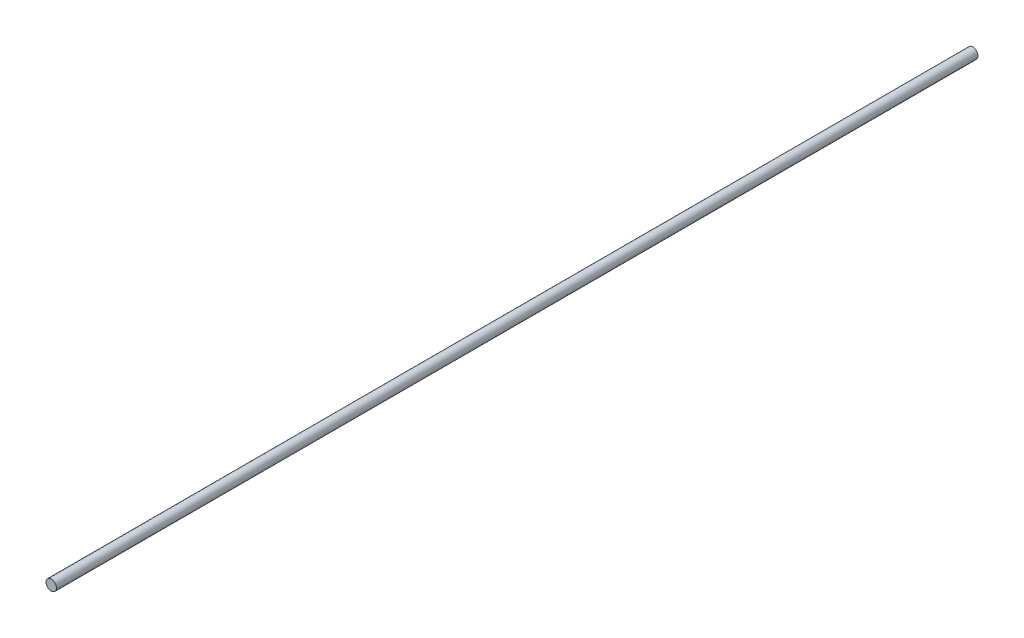
ISO-10303-21;
HEADER;
FILE_DESCRIPTION(('STEP AP214'),'2;1');
FILE_NAME('part.step','',(''),(''),'','','');
FILE_SCHEMA(('AUTOMOTIVE_DESIGN { 1 0 10303 214 1 1 1 1 }'));
ENDSEC;
DATA;
#1=APPLICATION_CONTEXT('core data for automotive mechanical design processes');
#2=APPLICATION_PROTOCOL_DEFINITION('international standard','automotive_design',2000,#1);
#3=PRODUCT_CONTEXT('',#1,'mechanical');
#4=PRODUCT('Part','Part','',(#3));
#5=PRODUCT_RELATED_PRODUCT_CATEGORY('part','',(#4));
#6=PRODUCT_DEFINITION_FORMATION('','',#4);
#7=PRODUCT_DEFINITION_CONTEXT('part definition',#1,'design');
#8=PRODUCT_DEFINITION('design','',#6,#7);
#9=PRODUCT_DEFINITION_SHAPE('','',#8);
#10=(LENGTH_UNIT() NAMED_UNIT(*) SI_UNIT(.MILLI.,.METRE.));
#11=(NAMED_UNIT(*) PLANE_ANGLE_UNIT() SI_UNIT($,.RADIAN.));
#12=(NAMED_UNIT(*) SI_UNIT($,.STERADIAN.) SOLID_ANGLE_UNIT());
#13=UNCERTAINTY_MEASURE_WITH_UNIT(LENGTH_MEASURE(1.E-05),#10,'distance_accuracy_value','');
#14=(GEOMETRIC_REPRESENTATION_CONTEXT(3) GLOBAL_UNCERTAINTY_ASSIGNED_CONTEXT((#13)) GLOBAL_UNIT_ASSIGNED_CONTEXT((#10,
#11,#12)) REPRESENTATION_CONTEXT('',''));
#15=CARTESIAN_POINT('',(0.,0.,0.));
#16=DIRECTION('',(0.,0.,1.));
#17=DIRECTION('',(1.,0.,0.));
#18=AXIS2_PLACEMENT_3D('',#15,#16,#17);
#19=CARTESIAN_POINT('',(14.8073455451213,22.8368231384729,1122.934));
#20=DIRECTION('',(0.,0.,-1.));
#21=DIRECTION('',(-1.,0.,0.));
#22=AXIS2_PLACEMENT_3D('',#19,#20,#21);
#23=CYLINDRICAL_SURFACE('',#22,6.35);
#24=CARTESIAN_POINT('',(14.8073455451213,22.8368231384729,1122.934));
#25=DIRECTION('',(0.,0.,1.));
#26=DIRECTION('',(1.,0.,0.));
#27=AXIS2_PLACEMENT_3D('',#24,#25,#26);
#28=CIRCLE('',#27,6.35);
#29=CARTESIAN_POINT('',(21.1573455451213,22.8368231384729,1122.934));
#30=VERTEX_POINT('',#29);
#31=EDGE_CURVE('E10',#30,#30,#28,.T.);
#32=ORIENTED_EDGE('',*,*,#31,.F.);
#33=EDGE_LOOP('',(#32));
#34=FACE_BOUND('',#33,.T.);
#35=CARTESIAN_POINT('',(14.8073455451213,22.8368231384729,0.));
#36=DIRECTION('',(0.,0.,1.));
#37=DIRECTION('',(1.,0.,0.));
#38=AXIS2_PLACEMENT_3D('',#35,#36,#37);
#39=CIRCLE('',#38,6.35);
#40=CARTESIAN_POINT('',(21.1573455451213,22.8368231384729,0.));
#41=VERTEX_POINT('',#40);
#42=EDGE_CURVE('E46',#41,#41,#39,.T.);
#43=ORIENTED_EDGE('',*,*,#42,.T.);
#44=EDGE_LOOP('',(#43));
#45=FACE_BOUND('',#44,.T.);
#46=ADVANCED_FACE('F43',(#34,#45),#23,.T.);
#47=CARTESIAN_POINT('',(14.8073455451213,22.8368231384729,1122.934));
#48=DIRECTION('',(0.,0.,1.));
#49=DIRECTION('',(1.,0.,0.));
#50=AXIS2_PLACEMENT_3D('',#47,#48,#49);
#51=PLANE('',#50);
#52=ORIENTED_EDGE('',*,*,#31,.T.);
#53=EDGE_LOOP('',(#52));
#54=FACE_BOUND('',#53,.T.);
#55=ADVANCED_FACE('F59',(#54),#51,.T.);
#56=CARTESIAN_POINT('',(14.8073455451213,22.8368231384729,0.));
#57=DIRECTION('',(0.,0.,1.));
#58=DIRECTION('',(1.,0.,0.));
#59=AXIS2_PLACEMENT_3D('',#56,#57,#58);
#60=PLANE('',#59);
#61=ORIENTED_EDGE('',*,*,#42,.F.);
#62=EDGE_LOOP('',(#61));
#63=FACE_BOUND('',#62,.T.);
#64=ADVANCED_FACE('F57',(#63),#60,.F.);
#65=CLOSED_SHELL('',(#46,#55,#64));
#66=MANIFOLD_SOLID_BREP('B2',#65);
#67=ADVANCED_BREP_SHAPE_REPRESENTATION('',(#18,#66),#14);
#68=SHAPE_DEFINITION_REPRESENTATION(#9,#67);
ENDSEC;
END-ISO-10303-21;
